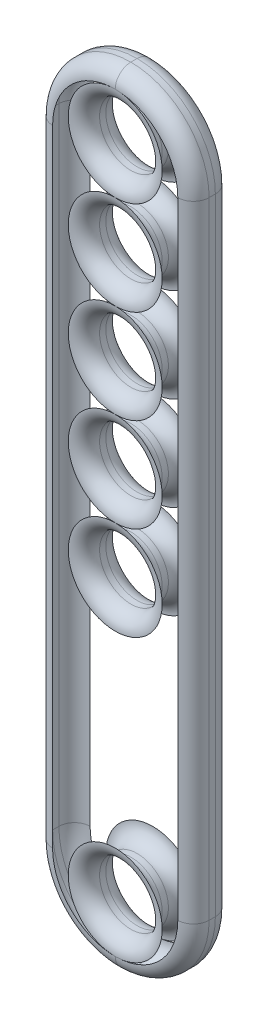
ISO-10303-21;
HEADER;
FILE_DESCRIPTION(('STEP AP214'),'2;1');
FILE_NAME('part.step','',(''),(''),'','','');
FILE_SCHEMA(('AUTOMOTIVE_DESIGN { 1 0 10303 214 1 1 1 1 }'));
ENDSEC;
DATA;
#1=APPLICATION_CONTEXT('core data for automotive mechanical design processes');
#2=APPLICATION_PROTOCOL_DEFINITION('international standard','automotive_design',2000,#1);
#3=PRODUCT_CONTEXT('',#1,'mechanical');
#4=PRODUCT('Part','Part','',(#3));
#5=PRODUCT_RELATED_PRODUCT_CATEGORY('part','',(#4));
#6=PRODUCT_DEFINITION_FORMATION('','',#4);
#7=PRODUCT_DEFINITION_CONTEXT('part definition',#1,'design');
#8=PRODUCT_DEFINITION('design','',#6,#7);
#9=PRODUCT_DEFINITION_SHAPE('','',#8);
#10=(LENGTH_UNIT() NAMED_UNIT(*) SI_UNIT(.MILLI.,.METRE.));
#11=(NAMED_UNIT(*) PLANE_ANGLE_UNIT() SI_UNIT($,.RADIAN.));
#12=(NAMED_UNIT(*) SI_UNIT($,.STERADIAN.) SOLID_ANGLE_UNIT());
#13=UNCERTAINTY_MEASURE_WITH_UNIT(LENGTH_MEASURE(1.E-05),#10,'distance_accuracy_value','');
#14=(GEOMETRIC_REPRESENTATION_CONTEXT(3) GLOBAL_UNCERTAINTY_ASSIGNED_CONTEXT((#13)) GLOBAL_UNIT_ASSIGNED_CONTEXT((#10,
#11,#12)) REPRESENTATION_CONTEXT('',''));
#15=CARTESIAN_POINT('',(0.,0.,0.));
#16=DIRECTION('',(0.,0.,1.));
#17=DIRECTION('',(1.,0.,0.));
#18=AXIS2_PLACEMENT_3D('',#15,#16,#17);
#19=CARTESIAN_POINT('',(0.,0.,2.4));
#20=DIRECTION('',(1.,0.,0.));
#21=DIRECTION('',(0.,0.,-1.));
#22=AXIS2_PLACEMENT_3D('',#19,#20,#21);
#23=PLANE('',#22);
#24=DIRECTION('',(0.,0.,-1.));
#25=VECTOR('',#24,1.);
#26=CARTESIAN_POINT('',(0.,45.,2.4));
#27=LINE('',#26,#25);
#28=CARTESIAN_POINT('',(0.,45.,1.4));
#29=VERTEX_POINT('',#28);
#30=CARTESIAN_POINT('',(0.,45.,1.));
#31=VERTEX_POINT('',#30);
#32=EDGE_CURVE('E504',#29,#31,#27,.T.);
#33=ORIENTED_EDGE('',*,*,#32,.T.);
#34=DIRECTION('',(0.,-1.,0.));
#35=VECTOR('',#34,1.);
#36=CARTESIAN_POINT('',(0.,5.,1.));
#37=LINE('',#36,#35);
#38=CARTESIAN_POINT('',(0.,5.,1.));
#39=VERTEX_POINT('',#38);
#40=EDGE_CURVE('E303',#31,#39,#37,.T.);
#41=ORIENTED_EDGE('',*,*,#40,.T.);
#42=DIRECTION('',(0.,0.,-1.));
#43=VECTOR('',#42,1.);
#44=CARTESIAN_POINT('',(0.,5.,2.4));
#45=LINE('',#44,#43);
#46=CARTESIAN_POINT('',(0.,5.,1.4));
#47=VERTEX_POINT('',#46);
#48=EDGE_CURVE('E509',#39,#47,#45,.F.);
#49=ORIENTED_EDGE('',*,*,#48,.T.);
#50=DIRECTION('',(0.,-1.,0.));
#51=VECTOR('',#50,1.);
#52=CARTESIAN_POINT('',(0.,0.,1.4));
#53=LINE('',#52,#51);
#54=EDGE_CURVE('E300',#47,#29,#53,.F.);
#55=ORIENTED_EDGE('',*,*,#54,.T.);
#56=EDGE_LOOP('',(#33,#41,#49,#55));
#57=FACE_BOUND('',#56,.T.);
#58=ADVANCED_FACE('F45',(#57),#23,.F.);
#59=CARTESIAN_POINT('',(10.,0.,2.4));
#60=DIRECTION('',(-1.,0.,0.));
#61=DIRECTION('',(0.,0.,1.));
#62=AXIS2_PLACEMENT_3D('',#59,#60,#61);
#63=PLANE('',#62);
#64=DIRECTION('',(0.,0.,-1.));
#65=VECTOR('',#64,1.);
#66=CARTESIAN_POINT('',(10.,5.,2.4));
#67=LINE('',#66,#65);
#68=CARTESIAN_POINT('',(10.,5.,1.4));
#69=VERTEX_POINT('',#68);
#70=CARTESIAN_POINT('',(10.,5.,1.));
#71=VERTEX_POINT('',#70);
#72=EDGE_CURVE('E217',#69,#71,#67,.T.);
#73=ORIENTED_EDGE('',*,*,#72,.T.);
#74=DIRECTION('',(0.,1.,0.));
#75=VECTOR('',#74,1.);
#76=CARTESIAN_POINT('',(10.,45.,1.));
#77=LINE('',#76,#75);
#78=CARTESIAN_POINT('',(10.,45.,1.));
#79=VERTEX_POINT('',#78);
#80=EDGE_CURVE('E369',#71,#79,#77,.T.);
#81=ORIENTED_EDGE('',*,*,#80,.T.);
#82=DIRECTION('',(0.,0.,-1.));
#83=VECTOR('',#82,1.);
#84=CARTESIAN_POINT('',(10.,45.,2.4));
#85=LINE('',#84,#83);
#86=CARTESIAN_POINT('',(10.,45.,1.4));
#87=VERTEX_POINT('',#86);
#88=EDGE_CURVE('E540',#79,#87,#85,.F.);
#89=ORIENTED_EDGE('',*,*,#88,.T.);
#90=DIRECTION('',(0.,1.,0.));
#91=VECTOR('',#90,1.);
#92=CARTESIAN_POINT('',(10.,0.,1.4));
#93=LINE('',#92,#91);
#94=EDGE_CURVE('E366',#87,#69,#93,.F.);
#95=ORIENTED_EDGE('',*,*,#94,.T.);
#96=EDGE_LOOP('',(#73,#81,#89,#95));
#97=FACE_BOUND('',#96,.T.);
#98=ADVANCED_FACE('F564',(#97),#63,.F.);
#99=CARTESIAN_POINT('',(0.,0.,2.4));
#100=DIRECTION('',(0.,0.,-1.));
#101=DIRECTION('',(-1.,0.,0.));
#102=AXIS2_PLACEMENT_3D('',#99,#100,#101);
#103=PLANE('',#102);
#104=CARTESIAN_POINT('',(5.,4.,2.4));
#105=DIRECTION('',(0.,0.,-1.));
#106=DIRECTION('',(-1.,0.,0.));
#107=AXIS2_PLACEMENT_3D('',#104,#105,#106);
#108=CIRCLE('',#107,3.);
#109=CARTESIAN_POINT('',(8.,4.,2.4));
#110=VERTEX_POINT('',#109);
#111=CARTESIAN_POINT('',(5.00000000000002,1.,2.4));
#112=VERTEX_POINT('',#111);
#113=EDGE_CURVE('E426',#110,#112,#108,.T.);
#114=ORIENTED_EDGE('',*,*,#113,.T.);
#115=CARTESIAN_POINT('',(5.,5.,2.4));
#116=DIRECTION('',(0.,0.,-1.));
#117=DIRECTION('',(-1.,0.,0.));
#118=AXIS2_PLACEMENT_3D('',#115,#116,#117);
#119=CIRCLE('',#118,4.);
#120=CARTESIAN_POINT('',(9.,5.,2.4));
#121=VERTEX_POINT('',#120);
#122=EDGE_CURVE('E11',#112,#121,#119,.F.);
#123=ORIENTED_EDGE('',*,*,#122,.T.);
#124=DIRECTION('',(0.,1.,0.));
#125=VECTOR('',#124,1.);
#126=CARTESIAN_POINT('',(9.,0.,2.4));
#127=LINE('',#126,#125);
#128=CARTESIAN_POINT('',(9.,45.,2.4));
#129=VERTEX_POINT('',#128);
#130=EDGE_CURVE('E55',#121,#129,#127,.T.);
#131=ORIENTED_EDGE('',*,*,#130,.T.);
#132=CARTESIAN_POINT('',(5.,45.,2.4));
#133=DIRECTION('',(0.,0.,-1.));
#134=DIRECTION('',(-1.,0.,0.));
#135=AXIS2_PLACEMENT_3D('',#132,#133,#134);
#136=CIRCLE('',#135,4.);
#137=CARTESIAN_POINT('',(5.,49.,2.4));
#138=VERTEX_POINT('',#137);
#139=EDGE_CURVE('E440',#129,#138,#136,.F.);
#140=ORIENTED_EDGE('',*,*,#139,.T.);
#141=CARTESIAN_POINT('',(5.,46.,2.4));
#142=DIRECTION('',(0.,0.,-1.));
#143=DIRECTION('',(-1.,0.,0.));
#144=AXIS2_PLACEMENT_3D('',#141,#142,#143);
#145=CIRCLE('',#144,3.);
#146=CARTESIAN_POINT('',(8.,46.,2.4));
#147=VERTEX_POINT('',#146);
#148=EDGE_CURVE('E372',#138,#147,#145,.T.);
#149=ORIENTED_EDGE('',*,*,#148,.T.);
#150=CARTESIAN_POINT('',(5.,46.,2.4));
#151=DIRECTION('',(0.,0.,-1.));
#152=DIRECTION('',(-1.,0.,0.));
#153=AXIS2_PLACEMENT_3D('',#150,#151,#152);
#154=CIRCLE('',#153,3.);
#155=CARTESIAN_POINT('',(5.,43.,2.4));
#156=VERTEX_POINT('',#155);
#157=EDGE_CURVE('E379',#147,#156,#154,.T.);
#158=ORIENTED_EDGE('',*,*,#157,.T.);
#159=CARTESIAN_POINT('',(5.,40.,2.4));
#160=DIRECTION('',(0.,0.,-1.));
#161=DIRECTION('',(-1.,0.,0.));
#162=AXIS2_PLACEMENT_3D('',#159,#160,#161);
#163=CIRCLE('',#162,3.);
#164=CARTESIAN_POINT('',(8.,40.,2.4));
#165=VERTEX_POINT('',#164);
#166=EDGE_CURVE('E383',#156,#165,#163,.T.);
#167=ORIENTED_EDGE('',*,*,#166,.T.);
#168=CARTESIAN_POINT('',(5.,40.,2.4));
#169=DIRECTION('',(0.,0.,-1.));
#170=DIRECTION('',(-1.,0.,0.));
#171=AXIS2_PLACEMENT_3D('',#168,#169,#170);
#172=CIRCLE('',#171,3.);
#173=CARTESIAN_POINT('',(5.,37.,2.4));
#174=VERTEX_POINT('',#173);
#175=EDGE_CURVE('E386',#165,#174,#172,.T.);
#176=ORIENTED_EDGE('',*,*,#175,.T.);
#177=CARTESIAN_POINT('',(5.,34.,2.4));
#178=DIRECTION('',(0.,0.,-1.));
#179=DIRECTION('',(-1.,0.,0.));
#180=AXIS2_PLACEMENT_3D('',#177,#178,#179);
#181=CIRCLE('',#180,3.);
#182=CARTESIAN_POINT('',(8.,34.,2.4));
#183=VERTEX_POINT('',#182);
#184=EDGE_CURVE('E390',#174,#183,#181,.T.);
#185=ORIENTED_EDGE('',*,*,#184,.T.);
#186=CARTESIAN_POINT('',(5.,34.,2.4));
#187=DIRECTION('',(0.,0.,-1.));
#188=DIRECTION('',(-1.,0.,0.));
#189=AXIS2_PLACEMENT_3D('',#186,#187,#188);
#190=CIRCLE('',#189,3.);
#191=CARTESIAN_POINT('',(5.,31.,2.4));
#192=VERTEX_POINT('',#191);
#193=EDGE_CURVE('E393',#183,#192,#190,.T.);
#194=ORIENTED_EDGE('',*,*,#193,.T.);
#195=CARTESIAN_POINT('',(5.,28.,2.4));
#196=DIRECTION('',(0.,0.,-1.));
#197=DIRECTION('',(-1.,0.,0.));
#198=AXIS2_PLACEMENT_3D('',#195,#196,#197);
#199=CIRCLE('',#198,3.);
#200=CARTESIAN_POINT('',(8.,28.,2.4));
#201=VERTEX_POINT('',#200);
#202=EDGE_CURVE('E397',#192,#201,#199,.T.);
#203=ORIENTED_EDGE('',*,*,#202,.T.);
#204=CARTESIAN_POINT('',(5.,28.,2.4));
#205=DIRECTION('',(0.,0.,-1.));
#206=DIRECTION('',(-1.,0.,0.));
#207=AXIS2_PLACEMENT_3D('',#204,#205,#206);
#208=CIRCLE('',#207,3.);
#209=CARTESIAN_POINT('',(5.,25.,2.4));
#210=VERTEX_POINT('',#209);
#211=EDGE_CURVE('E400',#201,#210,#208,.T.);
#212=ORIENTED_EDGE('',*,*,#211,.T.);
#213=CARTESIAN_POINT('',(5.,22.,2.4));
#214=DIRECTION('',(0.,0.,-1.));
#215=DIRECTION('',(-1.,0.,0.));
#216=AXIS2_PLACEMENT_3D('',#213,#214,#215);
#217=CIRCLE('',#216,3.);
#218=CARTESIAN_POINT('',(8.,22.,2.4));
#219=VERTEX_POINT('',#218);
#220=EDGE_CURVE('E404',#210,#219,#217,.T.);
#221=ORIENTED_EDGE('',*,*,#220,.T.);
#222=CARTESIAN_POINT('',(5.,22.,2.4));
#223=DIRECTION('',(0.,0.,-1.));
#224=DIRECTION('',(-1.,0.,0.));
#225=AXIS2_PLACEMENT_3D('',#222,#223,#224);
#226=CIRCLE('',#225,3.);
#227=EDGE_CURVE('E407',#219,#210,#226,.T.);
#228=ORIENTED_EDGE('',*,*,#227,.T.);
#229=CARTESIAN_POINT('',(5.,28.,2.4));
#230=DIRECTION('',(0.,0.,-1.));
#231=DIRECTION('',(-1.,0.,0.));
#232=AXIS2_PLACEMENT_3D('',#229,#230,#231);
#233=CIRCLE('',#232,3.);
#234=EDGE_CURVE('E411',#210,#192,#233,.T.);
#235=ORIENTED_EDGE('',*,*,#234,.T.);
#236=CARTESIAN_POINT('',(5.,34.,2.4));
#237=DIRECTION('',(0.,0.,-1.));
#238=DIRECTION('',(-1.,0.,0.));
#239=AXIS2_PLACEMENT_3D('',#236,#237,#238);
#240=CIRCLE('',#239,3.);
#241=EDGE_CURVE('E415',#192,#174,#240,.T.);
#242=ORIENTED_EDGE('',*,*,#241,.T.);
#243=CARTESIAN_POINT('',(5.,40.,2.4));
#244=DIRECTION('',(0.,0.,-1.));
#245=DIRECTION('',(-1.,0.,0.));
#246=AXIS2_PLACEMENT_3D('',#243,#244,#245);
#247=CIRCLE('',#246,3.);
#248=EDGE_CURVE('E419',#174,#156,#247,.T.);
#249=ORIENTED_EDGE('',*,*,#248,.T.);
#250=CARTESIAN_POINT('',(5.,46.,2.4));
#251=DIRECTION('',(0.,0.,-1.));
#252=DIRECTION('',(-1.,0.,0.));
#253=AXIS2_PLACEMENT_3D('',#250,#251,#252);
#254=CIRCLE('',#253,3.);
#255=EDGE_CURVE('E375',#156,#138,#254,.T.);
#256=ORIENTED_EDGE('',*,*,#255,.T.);
#257=CARTESIAN_POINT('',(5.,45.,2.4));
#258=DIRECTION('',(0.,0.,-1.));
#259=DIRECTION('',(-1.,0.,0.));
#260=AXIS2_PLACEMENT_3D('',#257,#258,#259);
#261=CIRCLE('',#260,4.);
#262=CARTESIAN_POINT('',(1.,45.,2.4));
#263=VERTEX_POINT('',#262);
#264=EDGE_CURVE('E436',#138,#263,#261,.F.);
#265=ORIENTED_EDGE('',*,*,#264,.T.);
#266=DIRECTION('',(0.,-1.,0.));
#267=VECTOR('',#266,1.);
#268=CARTESIAN_POINT('',(1.,0.,2.4));
#269=LINE('',#268,#267);
#270=CARTESIAN_POINT('',(1.,5.,2.4));
#271=VERTEX_POINT('',#270);
#272=EDGE_CURVE('E433',#263,#271,#269,.T.);
#273=ORIENTED_EDGE('',*,*,#272,.T.);
#274=CARTESIAN_POINT('',(5.,5.,2.4));
#275=DIRECTION('',(0.,0.,-1.));
#276=DIRECTION('',(-1.,0.,0.));
#277=AXIS2_PLACEMENT_3D('',#274,#275,#276);
#278=CIRCLE('',#277,4.);
#279=EDGE_CURVE('E429',#271,#112,#278,.F.);
#280=ORIENTED_EDGE('',*,*,#279,.T.);
#281=CARTESIAN_POINT('',(5.,4.,2.4));
#282=DIRECTION('',(0.,0.,-1.));
#283=DIRECTION('',(-1.,0.,0.));
#284=AXIS2_PLACEMENT_3D('',#281,#282,#283);
#285=CIRCLE('',#284,3.);
#286=EDGE_CURVE('E423',#112,#110,#285,.T.);
#287=ORIENTED_EDGE('',*,*,#286,.T.);
#288=EDGE_LOOP('',(#114,#123,#131,#140,#149,#158,#167,#176,#185,#194,#203,#212,#221,#228,#235,
#242,#249,#256,#265,#273,#280,#287));
#289=FACE_BOUND('',#288,.T.);
#290=ADVANCED_FACE('F554',(#289),#103,.F.);
#291=CARTESIAN_POINT('',(0.,0.,0.));
#292=DIRECTION('',(0.,0.,-1.));
#293=DIRECTION('',(-1.,0.,0.));
#294=AXIS2_PLACEMENT_3D('',#291,#292,#293);
#295=PLANE('',#294);
#296=CARTESIAN_POINT('',(5.,4.,0.));
#297=DIRECTION('',(0.,0.,-1.));
#298=DIRECTION('',(-1.,0.,0.));
#299=AXIS2_PLACEMENT_3D('',#296,#297,#298);
#300=CIRCLE('',#299,3.);
#301=CARTESIAN_POINT('',(5.,1.,0.));
#302=VERTEX_POINT('',#301);
#303=CARTESIAN_POINT('',(8.00000000000001,4.,0.));
#304=VERTEX_POINT('',#303);
#305=EDGE_CURVE('E281',#302,#304,#300,.F.);
#306=ORIENTED_EDGE('',*,*,#305,.T.);
#307=CARTESIAN_POINT('',(5.,4.,0.));
#308=DIRECTION('',(0.,0.,-1.));
#309=DIRECTION('',(-1.,0.,0.));
#310=AXIS2_PLACEMENT_3D('',#307,#308,#309);
#311=CIRCLE('',#310,3.);
#312=EDGE_CURVE('E284',#304,#302,#311,.F.);
#313=ORIENTED_EDGE('',*,*,#312,.T.);
#314=CARTESIAN_POINT('',(5.,5.,0.));
#315=DIRECTION('',(0.,0.,-1.));
#316=DIRECTION('',(-1.,0.,0.));
#317=AXIS2_PLACEMENT_3D('',#314,#315,#316);
#318=CIRCLE('',#317,4.);
#319=CARTESIAN_POINT('',(1.,5.,0.));
#320=VERTEX_POINT('',#319);
#321=EDGE_CURVE('E518',#302,#320,#318,.T.);
#322=ORIENTED_EDGE('',*,*,#321,.T.);
#323=DIRECTION('',(0.,-1.,0.));
#324=VECTOR('',#323,1.);
#325=CARTESIAN_POINT('',(1.,45.,0.));
#326=LINE('',#325,#324);
#327=CARTESIAN_POINT('',(1.,45.,0.));
#328=VERTEX_POINT('',#327);
#329=EDGE_CURVE('E233',#320,#328,#326,.F.);
#330=ORIENTED_EDGE('',*,*,#329,.T.);
#331=CARTESIAN_POINT('',(5.,45.,0.));
#332=DIRECTION('',(0.,0.,-1.));
#333=DIRECTION('',(-1.,0.,0.));
#334=AXIS2_PLACEMENT_3D('',#331,#332,#333);
#335=CIRCLE('',#334,4.);
#336=CARTESIAN_POINT('',(5.,49.,0.));
#337=VERTEX_POINT('',#336);
#338=EDGE_CURVE('E226',#328,#337,#335,.T.);
#339=ORIENTED_EDGE('',*,*,#338,.T.);
#340=CARTESIAN_POINT('',(5.,46.,0.));
#341=DIRECTION('',(0.,0.,-1.));
#342=DIRECTION('',(-1.,0.,0.));
#343=AXIS2_PLACEMENT_3D('',#340,#341,#342);
#344=CIRCLE('',#343,3.);
#345=CARTESIAN_POINT('',(5.,43.,0.));
#346=VERTEX_POINT('',#345);
#347=EDGE_CURVE('E225',#337,#346,#344,.F.);
#348=ORIENTED_EDGE('',*,*,#347,.T.);
#349=CARTESIAN_POINT('',(5.,40.,0.));
#350=DIRECTION('',(0.,0.,-1.));
#351=DIRECTION('',(-1.,0.,0.));
#352=AXIS2_PLACEMENT_3D('',#349,#350,#351);
#353=CIRCLE('',#352,3.);
#354=CARTESIAN_POINT('',(5.,37.,0.));
#355=VERTEX_POINT('',#354);
#356=EDGE_CURVE('E231',#346,#355,#353,.F.);
#357=ORIENTED_EDGE('',*,*,#356,.T.);
#358=CARTESIAN_POINT('',(5.,34.,0.));
#359=DIRECTION('',(0.,0.,-1.));
#360=DIRECTION('',(-1.,0.,0.));
#361=AXIS2_PLACEMENT_3D('',#358,#359,#360);
#362=CIRCLE('',#361,3.);
#363=CARTESIAN_POINT('',(5.,31.,0.));
#364=VERTEX_POINT('',#363);
#365=EDGE_CURVE('E240',#355,#364,#362,.F.);
#366=ORIENTED_EDGE('',*,*,#365,.T.);
#367=CARTESIAN_POINT('',(5.,28.,0.));
#368=DIRECTION('',(0.,0.,-1.));
#369=DIRECTION('',(-1.,0.,0.));
#370=AXIS2_PLACEMENT_3D('',#367,#368,#369);
#371=CIRCLE('',#370,3.);
#372=CARTESIAN_POINT('',(5.,25.,0.));
#373=VERTEX_POINT('',#372);
#374=EDGE_CURVE('E244',#364,#373,#371,.F.);
#375=ORIENTED_EDGE('',*,*,#374,.T.);
#376=CARTESIAN_POINT('',(5.,22.,0.));
#377=DIRECTION('',(0.,0.,-1.));
#378=DIRECTION('',(-1.,0.,0.));
#379=AXIS2_PLACEMENT_3D('',#376,#377,#378);
#380=CIRCLE('',#379,3.);
#381=CARTESIAN_POINT('',(8.,22.,0.));
#382=VERTEX_POINT('',#381);
#383=EDGE_CURVE('E248',#373,#382,#380,.F.);
#384=ORIENTED_EDGE('',*,*,#383,.T.);
#385=CARTESIAN_POINT('',(5.,22.,0.));
#386=DIRECTION('',(0.,0.,-1.));
#387=DIRECTION('',(-1.,0.,0.));
#388=AXIS2_PLACEMENT_3D('',#385,#386,#387);
#389=CIRCLE('',#388,3.);
#390=EDGE_CURVE('E251',#382,#373,#389,.F.);
#391=ORIENTED_EDGE('',*,*,#390,.T.);
#392=CARTESIAN_POINT('',(5.,28.,0.));
#393=DIRECTION('',(0.,0.,-1.));
#394=DIRECTION('',(-1.,0.,0.));
#395=AXIS2_PLACEMENT_3D('',#392,#393,#394);
#396=CIRCLE('',#395,3.);
#397=CARTESIAN_POINT('',(8.,28.,0.));
#398=VERTEX_POINT('',#397);
#399=EDGE_CURVE('E255',#373,#398,#396,.F.);
#400=ORIENTED_EDGE('',*,*,#399,.T.);
#401=CARTESIAN_POINT('',(5.,28.,0.));
#402=DIRECTION('',(0.,0.,-1.));
#403=DIRECTION('',(-1.,0.,0.));
#404=AXIS2_PLACEMENT_3D('',#401,#402,#403);
#405=CIRCLE('',#404,3.);
#406=EDGE_CURVE('E258',#398,#364,#405,.F.);
#407=ORIENTED_EDGE('',*,*,#406,.T.);
#408=CARTESIAN_POINT('',(5.,34.,0.));
#409=DIRECTION('',(0.,0.,-1.));
#410=DIRECTION('',(-1.,0.,0.));
#411=AXIS2_PLACEMENT_3D('',#408,#409,#410);
#412=CIRCLE('',#411,3.);
#413=CARTESIAN_POINT('',(8.,34.,0.));
#414=VERTEX_POINT('',#413);
#415=EDGE_CURVE('E262',#364,#414,#412,.F.);
#416=ORIENTED_EDGE('',*,*,#415,.T.);
#417=CARTESIAN_POINT('',(5.,34.,0.));
#418=DIRECTION('',(0.,0.,-1.));
#419=DIRECTION('',(-1.,0.,0.));
#420=AXIS2_PLACEMENT_3D('',#417,#418,#419);
#421=CIRCLE('',#420,3.);
#422=EDGE_CURVE('E265',#414,#355,#421,.F.);
#423=ORIENTED_EDGE('',*,*,#422,.T.);
#424=CARTESIAN_POINT('',(5.,40.,0.));
#425=DIRECTION('',(0.,0.,-1.));
#426=DIRECTION('',(-1.,0.,0.));
#427=AXIS2_PLACEMENT_3D('',#424,#425,#426);
#428=CIRCLE('',#427,3.);
#429=CARTESIAN_POINT('',(8.,40.,0.));
#430=VERTEX_POINT('',#429);
#431=EDGE_CURVE('E269',#355,#430,#428,.F.);
#432=ORIENTED_EDGE('',*,*,#431,.T.);
#433=CARTESIAN_POINT('',(5.,40.,0.));
#434=DIRECTION('',(0.,0.,-1.));
#435=DIRECTION('',(-1.,0.,0.));
#436=AXIS2_PLACEMENT_3D('',#433,#434,#435);
#437=CIRCLE('',#436,3.);
#438=EDGE_CURVE('E272',#430,#346,#437,.F.);
#439=ORIENTED_EDGE('',*,*,#438,.T.);
#440=CARTESIAN_POINT('',(5.,46.,0.));
#441=DIRECTION('',(0.,0.,-1.));
#442=DIRECTION('',(-1.,0.,0.));
#443=AXIS2_PLACEMENT_3D('',#440,#441,#442);
#444=CIRCLE('',#443,3.);
#445=CARTESIAN_POINT('',(8.,46.,0.));
#446=VERTEX_POINT('',#445);
#447=EDGE_CURVE('E276',#346,#446,#444,.F.);
#448=ORIENTED_EDGE('',*,*,#447,.T.);
#449=CARTESIAN_POINT('',(5.,46.,0.));
#450=DIRECTION('',(0.,0.,-1.));
#451=DIRECTION('',(-1.,0.,0.));
#452=AXIS2_PLACEMENT_3D('',#449,#450,#451);
#453=CIRCLE('',#452,3.);
#454=EDGE_CURVE('E222',#446,#337,#453,.F.);
#455=ORIENTED_EDGE('',*,*,#454,.T.);
#456=CARTESIAN_POINT('',(5.,45.,0.));
#457=DIRECTION('',(0.,0.,-1.));
#458=DIRECTION('',(-1.,0.,0.));
#459=AXIS2_PLACEMENT_3D('',#456,#457,#458);
#460=CIRCLE('',#459,4.);
#461=CARTESIAN_POINT('',(9.,45.,0.));
#462=VERTEX_POINT('',#461);
#463=EDGE_CURVE('E199',#337,#462,#460,.T.);
#464=ORIENTED_EDGE('',*,*,#463,.T.);
#465=DIRECTION('',(0.,1.,0.));
#466=VECTOR('',#465,1.);
#467=CARTESIAN_POINT('',(9.,5.,0.));
#468=LINE('',#467,#466);
#469=CARTESIAN_POINT('',(9.,5.,0.));
#470=VERTEX_POINT('',#469);
#471=EDGE_CURVE('E208',#462,#470,#468,.F.);
#472=ORIENTED_EDGE('',*,*,#471,.T.);
#473=CARTESIAN_POINT('',(5.,5.,0.));
#474=DIRECTION('',(0.,0.,-1.));
#475=DIRECTION('',(-1.,0.,0.));
#476=AXIS2_PLACEMENT_3D('',#473,#474,#475);
#477=CIRCLE('',#476,4.);
#478=EDGE_CURVE('E216',#470,#302,#477,.T.);
#479=ORIENTED_EDGE('',*,*,#478,.T.);
#480=EDGE_LOOP('',(#306,#313,#322,#330,#339,#348,#357,#366,#375,#384,#391,#400,#407,#416,#423,
#432,#439,#448,#455,#464,#472,#479));
#481=FACE_BOUND('',#480,.T.);
#482=ADVANCED_FACE('F220',(#481),#295,.T.);
#483=CARTESIAN_POINT('',(5.,4.,0.));
#484=DIRECTION('',(0.,0.,1.));
#485=DIRECTION('',(1.,0.,0.));
#486=AXIS2_PLACEMENT_3D('',#483,#484,#485);
#487=CYLINDRICAL_SURFACE('',#486,2.);
#488=CARTESIAN_POINT('',(5.,4.,1.));
#489=DIRECTION('',(0.,0.,-1.));
#490=DIRECTION('',(-1.,0.,0.));
#491=AXIS2_PLACEMENT_3D('',#488,#489,#490);
#492=CIRCLE('',#491,2.);
#493=CARTESIAN_POINT('',(3.,4.,1.));
#494=VERTEX_POINT('',#493);
#495=EDGE_CURVE('E322',#494,#494,#492,.T.);
#496=ORIENTED_EDGE('',*,*,#495,.T.);
#497=EDGE_LOOP('',(#496));
#498=FACE_BOUND('',#497,.T.);
#499=CARTESIAN_POINT('',(5.,4.,1.4));
#500=DIRECTION('',(0.,0.,-1.));
#501=DIRECTION('',(-1.,0.,0.));
#502=AXIS2_PLACEMENT_3D('',#499,#500,#501);
#503=CIRCLE('',#502,2.);
#504=CARTESIAN_POINT('',(3.,4.,1.4));
#505=VERTEX_POINT('',#504);
#506=EDGE_CURVE('E318',#505,#505,#503,.F.);
#507=ORIENTED_EDGE('',*,*,#506,.T.);
#508=EDGE_LOOP('',(#507));
#509=FACE_BOUND('',#508,.T.);
#510=ADVANCED_FACE('F580',(#498,#509),#487,.F.);
#511=CARTESIAN_POINT('',(5.,28.,0.));
#512=DIRECTION('',(0.,0.,1.));
#513=DIRECTION('',(1.,0.,0.));
#514=AXIS2_PLACEMENT_3D('',#511,#512,#513);
#515=CYLINDRICAL_SURFACE('',#514,2.);
#516=CARTESIAN_POINT('',(5.,28.,1.));
#517=DIRECTION('',(0.,0.,-1.));
#518=DIRECTION('',(-1.,0.,0.));
#519=AXIS2_PLACEMENT_3D('',#516,#517,#518);
#520=CIRCLE('',#519,2.);
#521=CARTESIAN_POINT('',(3.,28.,1.));
#522=VERTEX_POINT('',#521);
#523=EDGE_CURVE('E330',#522,#522,#520,.T.);
#524=ORIENTED_EDGE('',*,*,#523,.T.);
#525=EDGE_LOOP('',(#524));
#526=FACE_BOUND('',#525,.T.);
#527=CARTESIAN_POINT('',(5.,28.,1.4));
#528=DIRECTION('',(0.,0.,-1.));
#529=DIRECTION('',(-1.,0.,0.));
#530=AXIS2_PLACEMENT_3D('',#527,#528,#529);
#531=CIRCLE('',#530,2.);
#532=CARTESIAN_POINT('',(3.,28.,1.4));
#533=VERTEX_POINT('',#532);
#534=EDGE_CURVE('E326',#533,#533,#531,.F.);
#535=ORIENTED_EDGE('',*,*,#534,.T.);
#536=EDGE_LOOP('',(#535));
#537=FACE_BOUND('',#536,.T.);
#538=ADVANCED_FACE('F582',(#526,#537),#515,.F.);
#539=CARTESIAN_POINT('',(5.,40.,0.));
#540=DIRECTION('',(0.,0.,1.));
#541=DIRECTION('',(1.,0.,0.));
#542=AXIS2_PLACEMENT_3D('',#539,#540,#541);
#543=CYLINDRICAL_SURFACE('',#542,2.);
#544=CARTESIAN_POINT('',(5.,40.,1.));
#545=DIRECTION('',(0.,0.,-1.));
#546=DIRECTION('',(-1.,0.,0.));
#547=AXIS2_PLACEMENT_3D('',#544,#545,#546);
#548=CIRCLE('',#547,2.);
#549=CARTESIAN_POINT('',(3.,40.,1.));
#550=VERTEX_POINT('',#549);
#551=EDGE_CURVE('E338',#550,#550,#548,.T.);
#552=ORIENTED_EDGE('',*,*,#551,.T.);
#553=EDGE_LOOP('',(#552));
#554=FACE_BOUND('',#553,.T.);
#555=CARTESIAN_POINT('',(5.,40.,1.4));
#556=DIRECTION('',(0.,0.,-1.));
#557=DIRECTION('',(-1.,0.,0.));
#558=AXIS2_PLACEMENT_3D('',#555,#556,#557);
#559=CIRCLE('',#558,2.);
#560=CARTESIAN_POINT('',(3.,40.,1.4));
#561=VERTEX_POINT('',#560);
#562=EDGE_CURVE('E334',#561,#561,#559,.F.);
#563=ORIENTED_EDGE('',*,*,#562,.T.);
#564=EDGE_LOOP('',(#563));
#565=FACE_BOUND('',#564,.T.);
#566=ADVANCED_FACE('F589',(#554,#565),#543,.F.);
#567=CARTESIAN_POINT('',(5.,34.,0.));
#568=DIRECTION('',(0.,0.,1.));
#569=DIRECTION('',(1.,0.,0.));
#570=AXIS2_PLACEMENT_3D('',#567,#568,#569);
#571=CYLINDRICAL_SURFACE('',#570,2.);
#572=CARTESIAN_POINT('',(5.,34.,1.));
#573=DIRECTION('',(0.,0.,-1.));
#574=DIRECTION('',(-1.,0.,0.));
#575=AXIS2_PLACEMENT_3D('',#572,#573,#574);
#576=CIRCLE('',#575,2.);
#577=CARTESIAN_POINT('',(3.,34.,1.));
#578=VERTEX_POINT('',#577);
#579=EDGE_CURVE('E346',#578,#578,#576,.T.);
#580=ORIENTED_EDGE('',*,*,#579,.T.);
#581=EDGE_LOOP('',(#580));
#582=FACE_BOUND('',#581,.T.);
#583=CARTESIAN_POINT('',(5.,34.,1.4));
#584=DIRECTION('',(0.,0.,-1.));
#585=DIRECTION('',(-1.,0.,0.));
#586=AXIS2_PLACEMENT_3D('',#583,#584,#585);
#587=CIRCLE('',#586,2.);
#588=CARTESIAN_POINT('',(3.,34.,1.4));
#589=VERTEX_POINT('',#588);
#590=EDGE_CURVE('E342',#589,#589,#587,.F.);
#591=ORIENTED_EDGE('',*,*,#590,.T.);
#592=EDGE_LOOP('',(#591));
#593=FACE_BOUND('',#592,.T.);
#594=ADVANCED_FACE('F685',(#582,#593),#571,.F.);
#595=CARTESIAN_POINT('',(5.,22.,0.));
#596=DIRECTION('',(0.,0.,1.));
#597=DIRECTION('',(1.,0.,0.));
#598=AXIS2_PLACEMENT_3D('',#595,#596,#597);
#599=CYLINDRICAL_SURFACE('',#598,2.);
#600=CARTESIAN_POINT('',(5.,22.,1.));
#601=DIRECTION('',(0.,0.,-1.));
#602=DIRECTION('',(-1.,0.,0.));
#603=AXIS2_PLACEMENT_3D('',#600,#601,#602);
#604=CIRCLE('',#603,2.);
#605=CARTESIAN_POINT('',(3.,22.,1.));
#606=VERTEX_POINT('',#605);
#607=EDGE_CURVE('E354',#606,#606,#604,.T.);
#608=ORIENTED_EDGE('',*,*,#607,.T.);
#609=EDGE_LOOP('',(#608));
#610=FACE_BOUND('',#609,.T.);
#611=CARTESIAN_POINT('',(5.,22.,1.4));
#612=DIRECTION('',(0.,0.,-1.));
#613=DIRECTION('',(-1.,0.,0.));
#614=AXIS2_PLACEMENT_3D('',#611,#612,#613);
#615=CIRCLE('',#614,2.);
#616=CARTESIAN_POINT('',(3.,22.,1.4));
#617=VERTEX_POINT('',#616);
#618=EDGE_CURVE('E350',#617,#617,#615,.F.);
#619=ORIENTED_EDGE('',*,*,#618,.T.);
#620=EDGE_LOOP('',(#619));
#621=FACE_BOUND('',#620,.T.);
#622=ADVANCED_FACE('F683',(#610,#621),#599,.F.);
#623=CARTESIAN_POINT('',(5.,46.,0.));
#624=DIRECTION('',(0.,0.,1.));
#625=DIRECTION('',(1.,0.,0.));
#626=AXIS2_PLACEMENT_3D('',#623,#624,#625);
#627=CYLINDRICAL_SURFACE('',#626,2.);
#628=CARTESIAN_POINT('',(5.,46.,1.));
#629=DIRECTION('',(0.,0.,-1.));
#630=DIRECTION('',(-1.,0.,0.));
#631=AXIS2_PLACEMENT_3D('',#628,#629,#630);
#632=CIRCLE('',#631,2.);
#633=CARTESIAN_POINT('',(3.,46.,1.));
#634=VERTEX_POINT('',#633);
#635=EDGE_CURVE('E362',#634,#634,#632,.T.);
#636=ORIENTED_EDGE('',*,*,#635,.T.);
#637=EDGE_LOOP('',(#636));
#638=FACE_BOUND('',#637,.T.);
#639=CARTESIAN_POINT('',(5.,46.,1.4));
#640=DIRECTION('',(0.,0.,-1.));
#641=DIRECTION('',(-1.,0.,0.));
#642=AXIS2_PLACEMENT_3D('',#639,#640,#641);
#643=CIRCLE('',#642,2.);
#644=CARTESIAN_POINT('',(3.,46.,1.4));
#645=VERTEX_POINT('',#644);
#646=EDGE_CURVE('E358',#645,#645,#643,.F.);
#647=ORIENTED_EDGE('',*,*,#646,.T.);
#648=EDGE_LOOP('',(#647));
#649=FACE_BOUND('',#648,.T.);
#650=ADVANCED_FACE('F605',(#638,#649),#627,.F.);
#651=CARTESIAN_POINT('',(5.,5.,2.4));
#652=DIRECTION('',(0.,0.,-1.));
#653=DIRECTION('',(-1.,0.,0.));
#654=AXIS2_PLACEMENT_3D('',#651,#652,#653);
#655=CYLINDRICAL_SURFACE('',#654,5.);
#656=DIRECTION('',(0.,0.,-1.));
#657=VECTOR('',#656,1.);
#658=CARTESIAN_POINT('',(5.,0.,2.4));
#659=LINE('',#658,#657);
#660=CARTESIAN_POINT('',(5.,0.,1.));
#661=VERTEX_POINT('',#660);
#662=CARTESIAN_POINT('',(5.,0.,1.4));
#663=VERTEX_POINT('',#662);
#664=EDGE_CURVE('E495',#661,#663,#659,.F.);
#665=ORIENTED_EDGE('',*,*,#664,.F.);
#666=CARTESIAN_POINT('',(5.,5.,1.));
#667=DIRECTION('',(0.,0.,-1.));
#668=DIRECTION('',(-1.,0.,0.));
#669=AXIS2_PLACEMENT_3D('',#666,#667,#668);
#670=CIRCLE('',#669,5.);
#671=EDGE_CURVE('E315',#661,#71,#670,.F.);
#672=ORIENTED_EDGE('',*,*,#671,.T.);
#673=ORIENTED_EDGE('',*,*,#72,.F.);
#674=CARTESIAN_POINT('',(5.,5.,1.4));
#675=DIRECTION('',(0.,0.,-1.));
#676=DIRECTION('',(-1.,0.,0.));
#677=AXIS2_PLACEMENT_3D('',#674,#675,#676);
#678=CIRCLE('',#677,5.);
#679=EDGE_CURVE('E312',#69,#663,#678,.T.);
#680=ORIENTED_EDGE('',*,*,#679,.T.);
#681=EDGE_LOOP('',(#665,#672,#673,#680));
#682=FACE_BOUND('',#681,.T.);
#683=ADVANCED_FACE('F494',(#682),#655,.T.);
#684=CARTESIAN_POINT('',(5.,5.,2.4));
#685=DIRECTION('',(0.,0.,-1.));
#686=DIRECTION('',(-1.,0.,0.));
#687=AXIS2_PLACEMENT_3D('',#684,#685,#686);
#688=CYLINDRICAL_SURFACE('',#687,5.);
#689=ORIENTED_EDGE('',*,*,#48,.F.);
#690=CARTESIAN_POINT('',(5.,5.,1.));
#691=DIRECTION('',(0.,0.,-1.));
#692=DIRECTION('',(-1.,0.,0.));
#693=AXIS2_PLACEMENT_3D('',#690,#691,#692);
#694=CIRCLE('',#693,5.);
#695=EDGE_CURVE('E309',#39,#661,#694,.F.);
#696=ORIENTED_EDGE('',*,*,#695,.T.);
#697=ORIENTED_EDGE('',*,*,#664,.T.);
#698=CARTESIAN_POINT('',(5.,5.,1.4));
#699=DIRECTION('',(0.,0.,-1.));
#700=DIRECTION('',(-1.,0.,0.));
#701=AXIS2_PLACEMENT_3D('',#698,#699,#700);
#702=CIRCLE('',#701,5.);
#703=EDGE_CURVE('E306',#663,#47,#702,.T.);
#704=ORIENTED_EDGE('',*,*,#703,.T.);
#705=EDGE_LOOP('',(#689,#696,#697,#704));
#706=FACE_BOUND('',#705,.T.);
#707=ADVANCED_FACE('F500',(#706),#688,.T.);
#708=CARTESIAN_POINT('',(5.,45.,2.4));
#709=DIRECTION('',(0.,0.,-1.));
#710=DIRECTION('',(-1.,0.,0.));
#711=AXIS2_PLACEMENT_3D('',#708,#709,#710);
#712=CYLINDRICAL_SURFACE('',#711,5.);
#713=DIRECTION('',(0.,0.,-1.));
#714=VECTOR('',#713,1.);
#715=CARTESIAN_POINT('',(5.,50.,2.4));
#716=LINE('',#715,#714);
#717=CARTESIAN_POINT('',(5.,50.,1.));
#718=VERTEX_POINT('',#717);
#719=CARTESIAN_POINT('',(5.,50.,1.4));
#720=VERTEX_POINT('',#719);
#721=EDGE_CURVE('E461',#718,#720,#716,.F.);
#722=ORIENTED_EDGE('',*,*,#721,.F.);
#723=CARTESIAN_POINT('',(5.,45.,1.));
#724=DIRECTION('',(0.,0.,-1.));
#725=DIRECTION('',(-1.,0.,0.));
#726=AXIS2_PLACEMENT_3D('',#723,#724,#725);
#727=CIRCLE('',#726,5.);
#728=EDGE_CURVE('E297',#718,#31,#727,.F.);
#729=ORIENTED_EDGE('',*,*,#728,.T.);
#730=ORIENTED_EDGE('',*,*,#32,.F.);
#731=CARTESIAN_POINT('',(5.,45.,1.4));
#732=DIRECTION('',(0.,0.,-1.));
#733=DIRECTION('',(-1.,0.,0.));
#734=AXIS2_PLACEMENT_3D('',#731,#732,#733);
#735=CIRCLE('',#734,5.);
#736=EDGE_CURVE('E293',#29,#720,#735,.T.);
#737=ORIENTED_EDGE('',*,*,#736,.T.);
#738=EDGE_LOOP('',(#722,#729,#730,#737));
#739=FACE_BOUND('',#738,.T.);
#740=ADVANCED_FACE('F541',(#739),#712,.T.);
#741=CARTESIAN_POINT('',(5.,45.,2.4));
#742=DIRECTION('',(0.,0.,-1.));
#743=DIRECTION('',(-1.,0.,0.));
#744=AXIS2_PLACEMENT_3D('',#741,#742,#743);
#745=CYLINDRICAL_SURFACE('',#744,5.);
#746=ORIENTED_EDGE('',*,*,#88,.F.);
#747=CARTESIAN_POINT('',(5.,45.,1.));
#748=DIRECTION('',(0.,0.,-1.));
#749=DIRECTION('',(-1.,0.,0.));
#750=AXIS2_PLACEMENT_3D('',#747,#748,#749);
#751=CIRCLE('',#750,5.);
#752=EDGE_CURVE('E201',#79,#718,#751,.F.);
#753=ORIENTED_EDGE('',*,*,#752,.T.);
#754=ORIENTED_EDGE('',*,*,#721,.T.);
#755=CARTESIAN_POINT('',(5.,45.,1.4));
#756=DIRECTION('',(0.,0.,-1.));
#757=DIRECTION('',(-1.,0.,0.));
#758=AXIS2_PLACEMENT_3D('',#755,#756,#757);
#759=CIRCLE('',#758,5.);
#760=EDGE_CURVE('E288',#720,#87,#759,.T.);
#761=ORIENTED_EDGE('',*,*,#760,.T.);
#762=EDGE_LOOP('',(#746,#753,#754,#761));
#763=FACE_BOUND('',#762,.T.);
#764=ADVANCED_FACE('F538',(#763),#745,.T.);
#765=CARTESIAN_POINT('',(5.,5.,1.));
#766=DIRECTION('',(0.,0.,-1.));
#767=DIRECTION('',(-1.,0.,0.));
#768=AXIS2_PLACEMENT_3D('',#765,#766,#767);
#769=TOROIDAL_SURFACE('',#768,4.,1.);
#770=CARTESIAN_POINT('',(5.,1.,1.));
#771=DIRECTION('',(1.,0.,0.));
#772=DIRECTION('',(0.,0.,-1.));
#773=AXIS2_PLACEMENT_3D('',#770,#771,#772);
#774=CIRCLE('',#773,1.);
#775=EDGE_CURVE('E453',#661,#302,#774,.T.);
#776=ORIENTED_EDGE('',*,*,#775,.F.);
#777=ORIENTED_EDGE('',*,*,#695,.F.);
#778=CARTESIAN_POINT('',(1.,5.,1.));
#779=DIRECTION('',(0.,1.,0.));
#780=DIRECTION('',(0.,0.,1.));
#781=AXIS2_PLACEMENT_3D('',#778,#779,#780);
#782=CIRCLE('',#781,1.);
#783=EDGE_CURVE('E457',#320,#39,#782,.T.);
#784=ORIENTED_EDGE('',*,*,#783,.F.);
#785=ORIENTED_EDGE('',*,*,#321,.F.);
#786=EDGE_LOOP('',(#776,#777,#784,#785));
#787=FACE_BOUND('',#786,.T.);
#788=ADVANCED_FACE('F608',(#787),#769,.T.);
#789=CARTESIAN_POINT('',(1.,0.,1.));
#790=DIRECTION('',(0.,1.,0.));
#791=DIRECTION('',(0.,0.,1.));
#792=AXIS2_PLACEMENT_3D('',#789,#790,#791);
#793=CYLINDRICAL_SURFACE('',#792,1.);
#794=ORIENTED_EDGE('',*,*,#783,.T.);
#795=ORIENTED_EDGE('',*,*,#40,.F.);
#796=CARTESIAN_POINT('',(1.,45.,1.));
#797=DIRECTION('',(0.,1.,0.));
#798=DIRECTION('',(0.,0.,1.));
#799=AXIS2_PLACEMENT_3D('',#796,#797,#798);
#800=CIRCLE('',#799,1.);
#801=EDGE_CURVE('E449',#328,#31,#800,.T.);
#802=ORIENTED_EDGE('',*,*,#801,.F.);
#803=ORIENTED_EDGE('',*,*,#329,.F.);
#804=EDGE_LOOP('',(#794,#795,#802,#803));
#805=FACE_BOUND('',#804,.T.);
#806=ADVANCED_FACE('F529',(#805),#793,.T.);
#807=CARTESIAN_POINT('',(5.,5.,1.));
#808=DIRECTION('',(0.,0.,-1.));
#809=DIRECTION('',(-1.,0.,0.));
#810=AXIS2_PLACEMENT_3D('',#807,#808,#809);
#811=TOROIDAL_SURFACE('',#810,4.,1.);
#812=ORIENTED_EDGE('',*,*,#775,.T.);
#813=ORIENTED_EDGE('',*,*,#478,.F.);
#814=CARTESIAN_POINT('',(9.,5.,1.));
#815=DIRECTION('',(0.,1.,0.));
#816=DIRECTION('',(0.,0.,1.));
#817=AXIS2_PLACEMENT_3D('',#814,#815,#816);
#818=CIRCLE('',#817,1.);
#819=EDGE_CURVE('E211',#71,#470,#818,.T.);
#820=ORIENTED_EDGE('',*,*,#819,.F.);
#821=ORIENTED_EDGE('',*,*,#671,.F.);
#822=EDGE_LOOP('',(#812,#813,#820,#821));
#823=FACE_BOUND('',#822,.T.);
#824=ADVANCED_FACE('F618',(#823),#811,.T.);
#825=CARTESIAN_POINT('',(5.,45.,1.));
#826=DIRECTION('',(0.,0.,-1.));
#827=DIRECTION('',(-1.,0.,0.));
#828=AXIS2_PLACEMENT_3D('',#825,#826,#827);
#829=TOROIDAL_SURFACE('',#828,4.,1.);
#830=ORIENTED_EDGE('',*,*,#801,.T.);
#831=ORIENTED_EDGE('',*,*,#728,.F.);
#832=CARTESIAN_POINT('',(5.,49.,1.));
#833=DIRECTION('',(1.,0.,0.));
#834=DIRECTION('',(0.,0.,-1.));
#835=AXIS2_PLACEMENT_3D('',#832,#833,#834);
#836=CIRCLE('',#835,1.);
#837=EDGE_CURVE('E205',#337,#718,#836,.T.);
#838=ORIENTED_EDGE('',*,*,#837,.F.);
#839=ORIENTED_EDGE('',*,*,#338,.F.);
#840=EDGE_LOOP('',(#830,#831,#838,#839));
#841=FACE_BOUND('',#840,.T.);
#842=ADVANCED_FACE('F532',(#841),#829,.T.);
#843=CARTESIAN_POINT('',(9.,0.,1.));
#844=DIRECTION('',(0.,-1.,0.));
#845=DIRECTION('',(0.,0.,-1.));
#846=AXIS2_PLACEMENT_3D('',#843,#844,#845);
#847=CYLINDRICAL_SURFACE('',#846,1.);
#848=ORIENTED_EDGE('',*,*,#819,.T.);
#849=ORIENTED_EDGE('',*,*,#471,.F.);
#850=CARTESIAN_POINT('',(9.,45.,1.));
#851=DIRECTION('',(0.,1.,0.));
#852=DIRECTION('',(0.,0.,1.));
#853=AXIS2_PLACEMENT_3D('',#850,#851,#852);
#854=CIRCLE('',#853,1.);
#855=EDGE_CURVE('E195',#79,#462,#854,.T.);
#856=ORIENTED_EDGE('',*,*,#855,.F.);
#857=ORIENTED_EDGE('',*,*,#80,.F.);
#858=EDGE_LOOP('',(#848,#849,#856,#857));
#859=FACE_BOUND('',#858,.T.);
#860=ADVANCED_FACE('F209',(#859),#847,.T.);
#861=CARTESIAN_POINT('',(5.,45.,1.));
#862=DIRECTION('',(0.,0.,-1.));
#863=DIRECTION('',(-1.,0.,0.));
#864=AXIS2_PLACEMENT_3D('',#861,#862,#863);
#865=TOROIDAL_SURFACE('',#864,4.,1.);
#866=ORIENTED_EDGE('',*,*,#837,.T.);
#867=ORIENTED_EDGE('',*,*,#752,.F.);
#868=ORIENTED_EDGE('',*,*,#855,.T.);
#869=ORIENTED_EDGE('',*,*,#463,.F.);
#870=EDGE_LOOP('',(#866,#867,#868,#869));
#871=FACE_BOUND('',#870,.T.);
#872=ADVANCED_FACE('F197',(#871),#865,.T.);
#873=CARTESIAN_POINT('',(5.,4.,1.));
#874=DIRECTION('',(0.,0.,-1.));
#875=DIRECTION('',(-1.,0.,0.));
#876=AXIS2_PLACEMENT_3D('',#873,#874,#875);
#877=TOROIDAL_SURFACE('',#876,3.,1.);
#878=ORIENTED_EDGE('',*,*,#495,.F.);
#879=EDGE_LOOP('',(#878));
#880=FACE_BOUND('',#879,.T.);
#881=ORIENTED_EDGE('',*,*,#305,.F.);
#882=ORIENTED_EDGE('',*,*,#312,.F.);
#883=EDGE_LOOP('',(#881,#882));
#884=FACE_BOUND('',#883,.T.);
#885=ADVANCED_FACE('F613',(#880,#884),#877,.T.);
#886=CARTESIAN_POINT('',(5.,28.,1.));
#887=DIRECTION('',(0.,0.,-1.));
#888=DIRECTION('',(-1.,0.,0.));
#889=AXIS2_PLACEMENT_3D('',#886,#887,#888);
#890=TOROIDAL_SURFACE('',#889,3.,1.);
#891=ORIENTED_EDGE('',*,*,#523,.F.);
#892=EDGE_LOOP('',(#891));
#893=FACE_BOUND('',#892,.T.);
#894=ORIENTED_EDGE('',*,*,#374,.F.);
#895=ORIENTED_EDGE('',*,*,#406,.F.);
#896=ORIENTED_EDGE('',*,*,#399,.F.);
#897=EDGE_LOOP('',(#894,#895,#896));
#898=FACE_BOUND('',#897,.T.);
#899=ADVANCED_FACE('F629',(#893,#898),#890,.T.);
#900=CARTESIAN_POINT('',(5.,40.,1.));
#901=DIRECTION('',(0.,0.,-1.));
#902=DIRECTION('',(-1.,0.,0.));
#903=AXIS2_PLACEMENT_3D('',#900,#901,#902);
#904=TOROIDAL_SURFACE('',#903,3.,1.);
#905=ORIENTED_EDGE('',*,*,#551,.F.);
#906=EDGE_LOOP('',(#905));
#907=FACE_BOUND('',#906,.T.);
#908=ORIENTED_EDGE('',*,*,#356,.F.);
#909=ORIENTED_EDGE('',*,*,#438,.F.);
#910=ORIENTED_EDGE('',*,*,#431,.F.);
#911=EDGE_LOOP('',(#908,#909,#910));
#912=FACE_BOUND('',#911,.T.);
#913=ADVANCED_FACE('F633',(#907,#912),#904,.T.);
#914=CARTESIAN_POINT('',(5.,34.,1.));
#915=DIRECTION('',(0.,0.,-1.));
#916=DIRECTION('',(-1.,0.,0.));
#917=AXIS2_PLACEMENT_3D('',#914,#915,#916);
#918=TOROIDAL_SURFACE('',#917,3.,1.);
#919=ORIENTED_EDGE('',*,*,#579,.F.);
#920=EDGE_LOOP('',(#919));
#921=FACE_BOUND('',#920,.T.);
#922=ORIENTED_EDGE('',*,*,#365,.F.);
#923=ORIENTED_EDGE('',*,*,#422,.F.);
#924=ORIENTED_EDGE('',*,*,#415,.F.);
#925=EDGE_LOOP('',(#922,#923,#924));
#926=FACE_BOUND('',#925,.T.);
#927=ADVANCED_FACE('F637',(#921,#926),#918,.T.);
#928=CARTESIAN_POINT('',(5.,22.,1.));
#929=DIRECTION('',(0.,0.,-1.));
#930=DIRECTION('',(-1.,0.,0.));
#931=AXIS2_PLACEMENT_3D('',#928,#929,#930);
#932=TOROIDAL_SURFACE('',#931,3.,1.);
#933=ORIENTED_EDGE('',*,*,#607,.F.);
#934=EDGE_LOOP('',(#933));
#935=FACE_BOUND('',#934,.T.);
#936=ORIENTED_EDGE('',*,*,#383,.F.);
#937=ORIENTED_EDGE('',*,*,#390,.F.);
#938=EDGE_LOOP('',(#936,#937));
#939=FACE_BOUND('',#938,.T.);
#940=ADVANCED_FACE('F641',(#935,#939),#932,.T.);
#941=CARTESIAN_POINT('',(5.,46.,1.));
#942=DIRECTION('',(0.,0.,-1.));
#943=DIRECTION('',(-1.,0.,0.));
#944=AXIS2_PLACEMENT_3D('',#941,#942,#943);
#945=TOROIDAL_SURFACE('',#944,3.,1.);
#946=ORIENTED_EDGE('',*,*,#635,.F.);
#947=EDGE_LOOP('',(#946));
#948=FACE_BOUND('',#947,.T.);
#949=ORIENTED_EDGE('',*,*,#347,.F.);
#950=ORIENTED_EDGE('',*,*,#454,.F.);
#951=ORIENTED_EDGE('',*,*,#447,.F.);
#952=EDGE_LOOP('',(#949,#950,#951));
#953=FACE_BOUND('',#952,.T.);
#954=ADVANCED_FACE('F645',(#948,#953),#945,.T.);
#955=CARTESIAN_POINT('',(5.,5.,1.4));
#956=DIRECTION('',(0.,0.,-1.));
#957=DIRECTION('',(-1.,0.,0.));
#958=AXIS2_PLACEMENT_3D('',#955,#956,#957);
#959=TOROIDAL_SURFACE('',#958,4.,1.);
#960=CARTESIAN_POINT('',(5.,1.,1.4));
#961=DIRECTION('',(-1.,0.,0.));
#962=DIRECTION('',(0.,0.,1.));
#963=AXIS2_PLACEMENT_3D('',#960,#961,#962);
#964=CIRCLE('',#963,1.);
#965=EDGE_CURVE('E475',#663,#112,#964,.T.);
#966=ORIENTED_EDGE('',*,*,#965,.F.);
#967=ORIENTED_EDGE('',*,*,#679,.F.);
#968=CARTESIAN_POINT('',(9.,5.,1.4));
#969=DIRECTION('',(0.,1.,0.));
#970=DIRECTION('',(0.,0.,1.));
#971=AXIS2_PLACEMENT_3D('',#968,#969,#970);
#972=CIRCLE('',#971,1.);
#973=EDGE_CURVE('E49',#121,#69,#972,.T.);
#974=ORIENTED_EDGE('',*,*,#973,.F.);
#975=ORIENTED_EDGE('',*,*,#122,.F.);
#976=EDGE_LOOP('',(#966,#967,#974,#975));
#977=FACE_BOUND('',#976,.T.);
#978=ADVANCED_FACE('F489',(#977),#959,.T.);
#979=CARTESIAN_POINT('',(9.,0.,1.4));
#980=DIRECTION('',(0.,1.,0.));
#981=DIRECTION('',(0.,0.,1.));
#982=AXIS2_PLACEMENT_3D('',#979,#980,#981);
#983=CYLINDRICAL_SURFACE('',#982,1.);
#984=ORIENTED_EDGE('',*,*,#973,.T.);
#985=ORIENTED_EDGE('',*,*,#94,.F.);
#986=CARTESIAN_POINT('',(9.,45.,1.4));
#987=DIRECTION('',(0.,1.,0.));
#988=DIRECTION('',(0.,0.,1.));
#989=AXIS2_PLACEMENT_3D('',#986,#987,#988);
#990=CIRCLE('',#989,1.);
#991=EDGE_CURVE('E472',#129,#87,#990,.T.);
#992=ORIENTED_EDGE('',*,*,#991,.F.);
#993=ORIENTED_EDGE('',*,*,#130,.F.);
#994=EDGE_LOOP('',(#984,#985,#992,#993));
#995=FACE_BOUND('',#994,.T.);
#996=ADVANCED_FACE('F486',(#995),#983,.T.);
#997=CARTESIAN_POINT('',(5.,5.,1.4));
#998=DIRECTION('',(0.,0.,-1.));
#999=DIRECTION('',(-1.,0.,0.));
#1000=AXIS2_PLACEMENT_3D('',#997,#998,#999);
#1001=TOROIDAL_SURFACE('',#1000,4.,1.);
#1002=ORIENTED_EDGE('',*,*,#965,.T.);
#1003=ORIENTED_EDGE('',*,*,#279,.F.);
#1004=CARTESIAN_POINT('',(1.,5.,1.4));
#1005=DIRECTION('',(0.,1.,0.));
#1006=DIRECTION('',(0.,0.,1.));
#1007=AXIS2_PLACEMENT_3D('',#1004,#1005,#1006);
#1008=CIRCLE('',#1007,1.);
#1009=EDGE_CURVE('E468',#47,#271,#1008,.T.);
#1010=ORIENTED_EDGE('',*,*,#1009,.F.);
#1011=ORIENTED_EDGE('',*,*,#703,.F.);
#1012=EDGE_LOOP('',(#1002,#1003,#1010,#1011));
#1013=FACE_BOUND('',#1012,.T.);
#1014=ADVANCED_FACE('F570',(#1013),#1001,.T.);
#1015=CARTESIAN_POINT('',(5.,45.,1.4));
#1016=DIRECTION('',(0.,0.,-1.));
#1017=DIRECTION('',(-1.,0.,0.));
#1018=AXIS2_PLACEMENT_3D('',#1015,#1016,#1017);
#1019=TOROIDAL_SURFACE('',#1018,4.,1.);
#1020=ORIENTED_EDGE('',*,*,#991,.T.);
#1021=ORIENTED_EDGE('',*,*,#760,.F.);
#1022=CARTESIAN_POINT('',(5.,49.,1.4));
#1023=DIRECTION('',(-1.,0.,0.));
#1024=DIRECTION('',(0.,0.,1.));
#1025=AXIS2_PLACEMENT_3D('',#1022,#1023,#1024);
#1026=CIRCLE('',#1025,1.);
#1027=EDGE_CURVE('E465',#138,#720,#1026,.T.);
#1028=ORIENTED_EDGE('',*,*,#1027,.F.);
#1029=ORIENTED_EDGE('',*,*,#139,.F.);
#1030=EDGE_LOOP('',(#1020,#1021,#1028,#1029));
#1031=FACE_BOUND('',#1030,.T.);
#1032=ADVANCED_FACE('F562',(#1031),#1019,.T.);
#1033=CARTESIAN_POINT('',(1.,0.,1.4));
#1034=DIRECTION('',(0.,-1.,0.));
#1035=DIRECTION('',(0.,0.,-1.));
#1036=AXIS2_PLACEMENT_3D('',#1033,#1034,#1035);
#1037=CYLINDRICAL_SURFACE('',#1036,1.);
#1038=ORIENTED_EDGE('',*,*,#1009,.T.);
#1039=ORIENTED_EDGE('',*,*,#272,.F.);
#1040=CARTESIAN_POINT('',(1.,45.,1.4));
#1041=DIRECTION('',(0.,1.,0.));
#1042=DIRECTION('',(0.,0.,1.));
#1043=AXIS2_PLACEMENT_3D('',#1040,#1041,#1042);
#1044=CIRCLE('',#1043,1.);
#1045=EDGE_CURVE('E462',#29,#263,#1044,.T.);
#1046=ORIENTED_EDGE('',*,*,#1045,.F.);
#1047=ORIENTED_EDGE('',*,*,#54,.F.);
#1048=EDGE_LOOP('',(#1038,#1039,#1046,#1047));
#1049=FACE_BOUND('',#1048,.T.);
#1050=ADVANCED_FACE('F552',(#1049),#1037,.T.);
#1051=CARTESIAN_POINT('',(5.,45.,1.4));
#1052=DIRECTION('',(0.,0.,-1.));
#1053=DIRECTION('',(-1.,0.,0.));
#1054=AXIS2_PLACEMENT_3D('',#1051,#1052,#1053);
#1055=TOROIDAL_SURFACE('',#1054,4.,1.);
#1056=ORIENTED_EDGE('',*,*,#1027,.T.);
#1057=ORIENTED_EDGE('',*,*,#736,.F.);
#1058=ORIENTED_EDGE('',*,*,#1045,.T.);
#1059=ORIENTED_EDGE('',*,*,#264,.F.);
#1060=EDGE_LOOP('',(#1056,#1057,#1058,#1059));
#1061=FACE_BOUND('',#1060,.T.);
#1062=ADVANCED_FACE('F545',(#1061),#1055,.T.);
#1063=CARTESIAN_POINT('',(5.,4.,1.4));
#1064=DIRECTION('',(0.,0.,-1.));
#1065=DIRECTION('',(-1.,0.,0.));
#1066=AXIS2_PLACEMENT_3D('',#1063,#1064,#1065);
#1067=TOROIDAL_SURFACE('',#1066,3.,1.);
#1068=ORIENTED_EDGE('',*,*,#286,.F.);
#1069=ORIENTED_EDGE('',*,*,#113,.F.);
#1070=EDGE_LOOP('',(#1068,#1069));
#1071=FACE_BOUND('',#1070,.T.);
#1072=ORIENTED_EDGE('',*,*,#506,.F.);
#1073=EDGE_LOOP('',(#1072));
#1074=FACE_BOUND('',#1073,.T.);
#1075=ADVANCED_FACE('F573',(#1071,#1074),#1067,.T.);
#1076=CARTESIAN_POINT('',(5.,28.,1.4));
#1077=DIRECTION('',(0.,0.,-1.));
#1078=DIRECTION('',(-1.,0.,0.));
#1079=AXIS2_PLACEMENT_3D('',#1076,#1077,#1078);
#1080=TOROIDAL_SURFACE('',#1079,3.,1.);
#1081=ORIENTED_EDGE('',*,*,#234,.F.);
#1082=ORIENTED_EDGE('',*,*,#211,.F.);
#1083=ORIENTED_EDGE('',*,*,#202,.F.);
#1084=EDGE_LOOP('',(#1081,#1082,#1083));
#1085=FACE_BOUND('',#1084,.T.);
#1086=ORIENTED_EDGE('',*,*,#534,.F.);
#1087=EDGE_LOOP('',(#1086));
#1088=FACE_BOUND('',#1087,.T.);
#1089=ADVANCED_FACE('F576',(#1085,#1088),#1080,.T.);
#1090=CARTESIAN_POINT('',(5.,40.,1.4));
#1091=DIRECTION('',(0.,0.,-1.));
#1092=DIRECTION('',(-1.,0.,0.));
#1093=AXIS2_PLACEMENT_3D('',#1090,#1091,#1092);
#1094=TOROIDAL_SURFACE('',#1093,3.,1.);
#1095=ORIENTED_EDGE('',*,*,#248,.F.);
#1096=ORIENTED_EDGE('',*,*,#175,.F.);
#1097=ORIENTED_EDGE('',*,*,#166,.F.);
#1098=EDGE_LOOP('',(#1095,#1096,#1097));
#1099=FACE_BOUND('',#1098,.T.);
#1100=ORIENTED_EDGE('',*,*,#562,.F.);
#1101=EDGE_LOOP('',(#1100));
#1102=FACE_BOUND('',#1101,.T.);
#1103=ADVANCED_FACE('F664',(#1099,#1102),#1094,.T.);
#1104=CARTESIAN_POINT('',(5.,34.,1.4));
#1105=DIRECTION('',(0.,0.,-1.));
#1106=DIRECTION('',(-1.,0.,0.));
#1107=AXIS2_PLACEMENT_3D('',#1104,#1105,#1106);
#1108=TOROIDAL_SURFACE('',#1107,3.,1.);
#1109=ORIENTED_EDGE('',*,*,#241,.F.);
#1110=ORIENTED_EDGE('',*,*,#193,.F.);
#1111=ORIENTED_EDGE('',*,*,#184,.F.);
#1112=EDGE_LOOP('',(#1109,#1110,#1111));
#1113=FACE_BOUND('',#1112,.T.);
#1114=ORIENTED_EDGE('',*,*,#590,.F.);
#1115=EDGE_LOOP('',(#1114));
#1116=FACE_BOUND('',#1115,.T.);
#1117=ADVANCED_FACE('F668',(#1113,#1116),#1108,.T.);
#1118=CARTESIAN_POINT('',(5.,22.,1.4));
#1119=DIRECTION('',(0.,0.,-1.));
#1120=DIRECTION('',(-1.,0.,0.));
#1121=AXIS2_PLACEMENT_3D('',#1118,#1119,#1120);
#1122=TOROIDAL_SURFACE('',#1121,3.,1.);
#1123=ORIENTED_EDGE('',*,*,#220,.F.);
#1124=ORIENTED_EDGE('',*,*,#227,.F.);
#1125=EDGE_LOOP('',(#1123,#1124));
#1126=FACE_BOUND('',#1125,.T.);
#1127=ORIENTED_EDGE('',*,*,#618,.F.);
#1128=EDGE_LOOP('',(#1127));
#1129=FACE_BOUND('',#1128,.T.);
#1130=ADVANCED_FACE('F671',(#1126,#1129),#1122,.T.);
#1131=CARTESIAN_POINT('',(5.,46.,1.4));
#1132=DIRECTION('',(0.,0.,-1.));
#1133=DIRECTION('',(-1.,0.,0.));
#1134=AXIS2_PLACEMENT_3D('',#1131,#1132,#1133);
#1135=TOROIDAL_SURFACE('',#1134,3.,1.);
#1136=ORIENTED_EDGE('',*,*,#255,.F.);
#1137=ORIENTED_EDGE('',*,*,#157,.F.);
#1138=ORIENTED_EDGE('',*,*,#148,.F.);
#1139=EDGE_LOOP('',(#1136,#1137,#1138));
#1140=FACE_BOUND('',#1139,.T.);
#1141=ORIENTED_EDGE('',*,*,#646,.F.);
#1142=EDGE_LOOP('',(#1141));
#1143=FACE_BOUND('',#1142,.T.);
#1144=ADVANCED_FACE('F47',(#1140,#1143),#1135,.T.);
#1145=CLOSED_SHELL('',(#58,#98,#290,#482,#510,#538,#566,#594,#622,#650,#683,#707,#740,#764,#788,
#806,#824,#842,#860,#872,#885,#899,#913,#927,#940,#954,#978,#996,#1014,#1032,#1050,#1062,#1075,
#1089,#1103,#1117,#1130,#1144));
#1146=MANIFOLD_SOLID_BREP('B2',#1145);
#1147=ADVANCED_BREP_SHAPE_REPRESENTATION('',(#18,#1146),#14);
#1148=SHAPE_DEFINITION_REPRESENTATION(#9,#1147);
ENDSEC;
END-ISO-10303-21;
